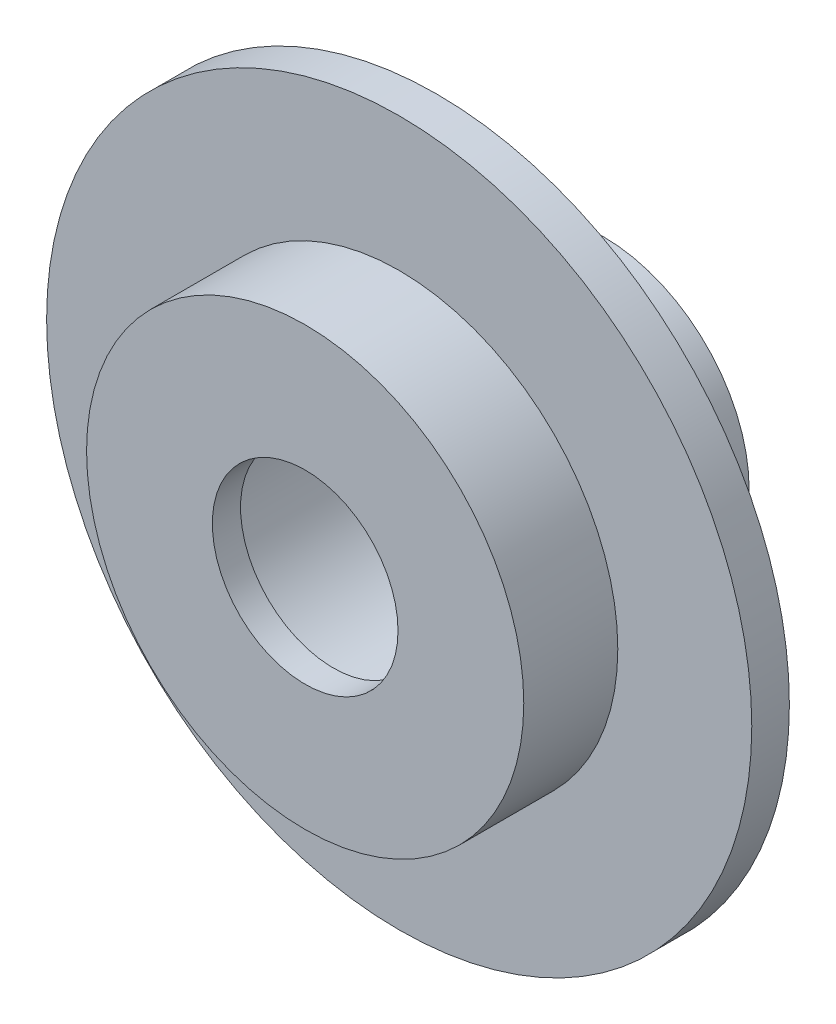
ISO-10303-21;
HEADER;
FILE_DESCRIPTION(('STEP AP214'),'2;1');
FILE_NAME('part.step','',(''),(''),'','','');
FILE_SCHEMA(('AUTOMOTIVE_DESIGN { 1 0 10303 214 1 1 1 1 }'));
ENDSEC;
DATA;
#1=APPLICATION_CONTEXT('core data for automotive mechanical design processes');
#2=APPLICATION_PROTOCOL_DEFINITION('international standard','automotive_design',2000,#1);
#3=PRODUCT_CONTEXT('',#1,'mechanical');
#4=PRODUCT('Part','Part','',(#3));
#5=PRODUCT_RELATED_PRODUCT_CATEGORY('part','',(#4));
#6=PRODUCT_DEFINITION_FORMATION('','',#4);
#7=PRODUCT_DEFINITION_CONTEXT('part definition',#1,'design');
#8=PRODUCT_DEFINITION('design','',#6,#7);
#9=PRODUCT_DEFINITION_SHAPE('','',#8);
#10=(LENGTH_UNIT() NAMED_UNIT(*) SI_UNIT(.MILLI.,.METRE.));
#11=(NAMED_UNIT(*) PLANE_ANGLE_UNIT() SI_UNIT($,.RADIAN.));
#12=(NAMED_UNIT(*) SI_UNIT($,.STERADIAN.) SOLID_ANGLE_UNIT());
#13=UNCERTAINTY_MEASURE_WITH_UNIT(LENGTH_MEASURE(1.E-05),#10,'distance_accuracy_value','');
#14=(GEOMETRIC_REPRESENTATION_CONTEXT(3) GLOBAL_UNCERTAINTY_ASSIGNED_CONTEXT((#13)) GLOBAL_UNIT_ASSIGNED_CONTEXT((#10,
#11,#12)) REPRESENTATION_CONTEXT('',''));
#15=CARTESIAN_POINT('',(0.,0.,0.));
#16=DIRECTION('',(0.,0.,1.));
#17=DIRECTION('',(1.,0.,0.));
#18=AXIS2_PLACEMENT_3D('',#15,#16,#17);
#19=CARTESIAN_POINT('',(0.,0.,2.032));
#20=DIRECTION('',(0.,0.,-1.));
#21=DIRECTION('',(-1.,0.,0.));
#22=AXIS2_PLACEMENT_3D('',#19,#20,#21);
#23=CYLINDRICAL_SURFACE('',#22,19.05);
#24=CARTESIAN_POINT('',(0.,0.,2.032));
#25=DIRECTION('',(0.,0.,1.));
#26=DIRECTION('',(1.,0.,0.));
#27=AXIS2_PLACEMENT_3D('',#24,#25,#26);
#28=CIRCLE('',#27,19.05);
#29=CARTESIAN_POINT('',(19.05,0.,2.032));
#30=VERTEX_POINT('',#29);
#31=EDGE_CURVE('E49',#30,#30,#28,.T.);
#32=ORIENTED_EDGE('',*,*,#31,.F.);
#33=EDGE_LOOP('',(#32));
#34=FACE_BOUND('',#33,.T.);
#35=CARTESIAN_POINT('',(0.,0.,0.));
#36=DIRECTION('',(0.,0.,1.));
#37=DIRECTION('',(1.,0.,0.));
#38=AXIS2_PLACEMENT_3D('',#35,#36,#37);
#39=CIRCLE('',#38,19.05);
#40=CARTESIAN_POINT('',(19.05,0.,0.));
#41=VERTEX_POINT('',#40);
#42=EDGE_CURVE('E53',#41,#41,#39,.T.);
#43=ORIENTED_EDGE('',*,*,#42,.T.);
#44=EDGE_LOOP('',(#43));
#45=FACE_BOUND('',#44,.T.);
#46=ADVANCED_FACE('F43',(#34,#45),#23,.T.);
#47=CARTESIAN_POINT('',(0.,0.,2.032));
#48=DIRECTION('',(0.,0.,1.));
#49=DIRECTION('',(1.,0.,0.));
#50=AXIS2_PLACEMENT_3D('',#47,#48,#49);
#51=PLANE('',#50);
#52=CARTESIAN_POINT('',(0.,0.,2.032));
#53=DIRECTION('',(0.,0.,1.));
#54=DIRECTION('',(1.,0.,0.));
#55=AXIS2_PLACEMENT_3D('',#52,#53,#54);
#56=CIRCLE('',#55,11.811);
#57=CARTESIAN_POINT('',(11.811,0.,2.032));
#58=VERTEX_POINT('',#57);
#59=EDGE_CURVE('E60',#58,#58,#56,.T.);
#60=ORIENTED_EDGE('',*,*,#59,.F.);
#61=EDGE_LOOP('',(#60));
#62=FACE_BOUND('',#61,.T.);
#63=ORIENTED_EDGE('',*,*,#31,.T.);
#64=EDGE_LOOP('',(#63));
#65=FACE_BOUND('',#64,.T.);
#66=ADVANCED_FACE('F102',(#62,#65),#51,.T.);
#67=CARTESIAN_POINT('',(0.,0.,0.));
#68=DIRECTION('',(0.,0.,1.));
#69=DIRECTION('',(1.,0.,0.));
#70=AXIS2_PLACEMENT_3D('',#67,#68,#69);
#71=PLANE('',#70);
#72=CARTESIAN_POINT('',(0.,0.,0.));
#73=DIRECTION('',(0.,0.,1.));
#74=DIRECTION('',(1.,0.,0.));
#75=AXIS2_PLACEMENT_3D('',#72,#73,#74);
#76=CIRCLE('',#75,7.875);
#77=CARTESIAN_POINT('',(7.875,0.,0.));
#78=VERTEX_POINT('',#77);
#79=EDGE_CURVE('E12',#78,#78,#76,.F.);
#80=ORIENTED_EDGE('',*,*,#79,.F.);
#81=EDGE_LOOP('',(#80));
#82=FACE_BOUND('',#81,.T.);
#83=ORIENTED_EDGE('',*,*,#42,.F.);
#84=EDGE_LOOP('',(#83));
#85=FACE_BOUND('',#84,.T.);
#86=ADVANCED_FACE('F107',(#82,#85),#71,.F.);
#87=CARTESIAN_POINT('',(0.,0.,7.112));
#88=DIRECTION('',(0.,0.,-1.));
#89=DIRECTION('',(-1.,0.,0.));
#90=AXIS2_PLACEMENT_3D('',#87,#88,#89);
#91=CYLINDRICAL_SURFACE('',#90,11.811);
#92=CARTESIAN_POINT('',(0.,0.,7.112));
#93=DIRECTION('',(0.,0.,1.));
#94=DIRECTION('',(1.,0.,0.));
#95=AXIS2_PLACEMENT_3D('',#92,#93,#94);
#96=CIRCLE('',#95,11.811);
#97=CARTESIAN_POINT('',(11.811,0.,7.112));
#98=VERTEX_POINT('',#97);
#99=EDGE_CURVE('E58',#98,#98,#96,.T.);
#100=ORIENTED_EDGE('',*,*,#99,.F.);
#101=EDGE_LOOP('',(#100));
#102=FACE_BOUND('',#101,.T.);
#103=ORIENTED_EDGE('',*,*,#59,.T.);
#104=EDGE_LOOP('',(#103));
#105=FACE_BOUND('',#104,.T.);
#106=ADVANCED_FACE('F114',(#102,#105),#91,.T.);
#107=CARTESIAN_POINT('',(0.,0.,7.112));
#108=DIRECTION('',(0.,0.,1.));
#109=DIRECTION('',(1.,0.,0.));
#110=AXIS2_PLACEMENT_3D('',#107,#108,#109);
#111=PLANE('',#110);
#112=CARTESIAN_POINT('',(0.,0.,7.112));
#113=DIRECTION('',(0.,0.,1.));
#114=DIRECTION('',(1.,0.,0.));
#115=AXIS2_PLACEMENT_3D('',#112,#113,#114);
#116=CIRCLE('',#115,5.0165);
#117=CARTESIAN_POINT('',(5.0165,0.,7.112));
#118=VERTEX_POINT('',#117);
#119=EDGE_CURVE('E63',#118,#118,#116,.T.);
#120=ORIENTED_EDGE('',*,*,#119,.F.);
#121=EDGE_LOOP('',(#120));
#122=FACE_BOUND('',#121,.T.);
#123=ORIENTED_EDGE('',*,*,#99,.T.);
#124=EDGE_LOOP('',(#123));
#125=FACE_BOUND('',#124,.T.);
#126=ADVANCED_FACE('F98',(#122,#125),#111,.T.);
#127=CARTESIAN_POINT('',(0.,0.,5.588));
#128=DIRECTION('',(0.,0.,1.));
#129=DIRECTION('',(1.,0.,0.));
#130=AXIS2_PLACEMENT_3D('',#127,#128,#129);
#131=CYLINDRICAL_SURFACE('',#130,5.0165);
#132=CARTESIAN_POINT('',(0.,0.,5.588));
#133=DIRECTION('',(0.,0.,1.));
#134=DIRECTION('',(1.,0.,0.));
#135=AXIS2_PLACEMENT_3D('',#132,#133,#134);
#136=CIRCLE('',#135,5.0165);
#137=CARTESIAN_POINT('',(5.0165,0.,5.588));
#138=VERTEX_POINT('',#137);
#139=EDGE_CURVE('E71',#138,#138,#136,.F.);
#140=CARTESIAN_POINT('',(5.0165,0.,5.588));
#141=CARTESIAN_POINT('',(5.0165,0.,5.603875));
#142=CARTESIAN_POINT('',(5.0165,0.,5.61975));
#143=CARTESIAN_POINT('',(5.0165,0.,5.6515));
#144=CARTESIAN_POINT('',(5.0165,0.,5.667375));
#145=CARTESIAN_POINT('',(5.0165,0.,5.699125));
#146=CARTESIAN_POINT('',(5.0165,0.,5.715));
#147=CARTESIAN_POINT('',(5.0165,0.,5.74675));
#148=CARTESIAN_POINT('',(5.0165,0.,5.762625));
#149=CARTESIAN_POINT('',(5.0165,0.,5.794375));
#150=CARTESIAN_POINT('',(5.0165,0.,5.81025));
#151=CARTESIAN_POINT('',(5.0165,0.,5.842));
#152=CARTESIAN_POINT('',(5.0165,0.,5.857875));
#153=CARTESIAN_POINT('',(5.0165,0.,5.889625));
#154=CARTESIAN_POINT('',(5.0165,0.,5.9055));
#155=CARTESIAN_POINT('',(5.0165,0.,5.93725));
#156=CARTESIAN_POINT('',(5.0165,0.,5.953125));
#157=CARTESIAN_POINT('',(5.0165,0.,5.984875));
#158=CARTESIAN_POINT('',(5.0165,0.,6.00075));
#159=CARTESIAN_POINT('',(5.0165,0.,6.0325));
#160=CARTESIAN_POINT('',(5.0165,0.,6.048375));
#161=CARTESIAN_POINT('',(5.0165,0.,6.080125));
#162=CARTESIAN_POINT('',(5.0165,0.,6.096));
#163=CARTESIAN_POINT('',(5.0165,0.,6.12775));
#164=CARTESIAN_POINT('',(5.0165,0.,6.143625));
#165=CARTESIAN_POINT('',(5.0165,0.,6.175375));
#166=CARTESIAN_POINT('',(5.0165,0.,6.19125));
#167=CARTESIAN_POINT('',(5.0165,0.,6.223));
#168=CARTESIAN_POINT('',(5.0165,0.,6.238875));
#169=CARTESIAN_POINT('',(5.0165,0.,6.270625));
#170=CARTESIAN_POINT('',(5.0165,0.,6.2865));
#171=CARTESIAN_POINT('',(5.0165,0.,6.31825));
#172=CARTESIAN_POINT('',(5.0165,0.,6.334125));
#173=CARTESIAN_POINT('',(5.0165,0.,6.365875));
#174=CARTESIAN_POINT('',(5.0165,0.,6.38175));
#175=CARTESIAN_POINT('',(5.0165,0.,6.4135));
#176=CARTESIAN_POINT('',(5.0165,0.,6.429375));
#177=CARTESIAN_POINT('',(5.0165,0.,6.461125));
#178=CARTESIAN_POINT('',(5.0165,0.,6.477));
#179=CARTESIAN_POINT('',(5.0165,0.,6.50875));
#180=CARTESIAN_POINT('',(5.0165,0.,6.524625));
#181=CARTESIAN_POINT('',(5.0165,0.,6.556375));
#182=CARTESIAN_POINT('',(5.0165,0.,6.57225));
#183=CARTESIAN_POINT('',(5.0165,0.,6.604));
#184=CARTESIAN_POINT('',(5.0165,0.,6.619875));
#185=CARTESIAN_POINT('',(5.0165,0.,6.651625));
#186=CARTESIAN_POINT('',(5.0165,0.,6.6675));
#187=CARTESIAN_POINT('',(5.0165,0.,6.69925));
#188=CARTESIAN_POINT('',(5.0165,0.,6.715125));
#189=CARTESIAN_POINT('',(5.0165,0.,6.746875));
#190=CARTESIAN_POINT('',(5.0165,0.,6.76275));
#191=CARTESIAN_POINT('',(5.0165,0.,6.7945));
#192=CARTESIAN_POINT('',(5.0165,0.,6.810375));
#193=CARTESIAN_POINT('',(5.0165,0.,6.842125));
#194=CARTESIAN_POINT('',(5.0165,0.,6.858));
#195=CARTESIAN_POINT('',(5.0165,0.,6.88975));
#196=CARTESIAN_POINT('',(5.0165,0.,6.905625));
#197=CARTESIAN_POINT('',(5.0165,0.,6.937375));
#198=CARTESIAN_POINT('',(5.0165,0.,6.95325));
#199=CARTESIAN_POINT('',(5.0165,0.,6.985));
#200=CARTESIAN_POINT('',(5.0165,0.,7.000875));
#201=CARTESIAN_POINT('',(5.0165,0.,7.032625));
#202=CARTESIAN_POINT('',(5.0165,0.,7.0485));
#203=CARTESIAN_POINT('',(5.0165,0.,7.08025));
#204=CARTESIAN_POINT('',(5.0165,0.,7.096125));
#205=CARTESIAN_POINT('',(5.0165,0.,7.112));
#206=B_SPLINE_CURVE_WITH_KNOTS('',3,(#140,#141,#142,#143,#144,#145,#146,#147,#148,#149,#150,
#151,#152,#153,#154,#155,#156,#157,#158,#159,#160,#161,#162,#163,#164,#165,#166,#167,#168,#169,
#170,#171,#172,#173,#174,#175,#176,#177,#178,#179,#180,#181,#182,#183,#184,#185,#186,#187,#188,
#189,#190,#191,#192,#193,#194,#195,#196,#197,#198,#199,#200,#201,#202,#203,#204,#205),
.UNSPECIFIED.,.F.,.F.,(4,2,2,2,2,2,2,2,2,2,2,2,2,2,2,2,2,2,2,2,2,2,2,2,2,2,2,2,2,2,2,2,4),(0.,
0.0476250000000008,0.0952500000000007,0.142875000000001,0.190500000000001,0.238125,0.28575,
0.333375,0.381,0.428625,0.47625,0.523875,0.571500000000001,0.619125000000001,0.666750000000001,
0.714375000000001,0.762000000000001,0.809625,0.85725,0.904875,0.9525,1.000125,1.04775,1.095375,
1.143,1.190625,1.23825,1.285875,1.3335,1.381125,1.42875,1.476375,1.524),.UNSPECIFIED.);
#207=EDGE_CURVE('BSEAM93',#138,#118,#206,.T.);
#208=ORIENTED_EDGE('',*,*,#139,.T.);
#209=ORIENTED_EDGE('',*,*,#119,.T.);
#210=ORIENTED_EDGE('',*,*,#207,.T.);
#211=ORIENTED_EDGE('',*,*,#207,.F.);
#212=EDGE_LOOP('',(#208,#210,#209,#211));
#213=FACE_BOUND('',#212,.T.);
#214=ADVANCED_FACE('F93',(#213),#131,.F.);
#215=CARTESIAN_POINT('',(0.,0.,-9.));
#216=DIRECTION('',(0.,0.,1.));
#217=DIRECTION('',(1.,0.,0.));
#218=AXIS2_PLACEMENT_3D('',#215,#216,#217);
#219=CYLINDRICAL_SURFACE('',#218,7.875);
#220=CARTESIAN_POINT('',(0.,0.,-9.));
#221=DIRECTION('',(0.,0.,-1.));
#222=DIRECTION('',(-1.,0.,0.));
#223=AXIS2_PLACEMENT_3D('',#220,#221,#222);
#224=CIRCLE('',#223,7.875);
#225=CARTESIAN_POINT('',(-7.875,0.,-9.));
#226=VERTEX_POINT('',#225);
#227=EDGE_CURVE('E68',#226,#226,#224,.T.);
#228=ORIENTED_EDGE('',*,*,#227,.F.);
#229=EDGE_LOOP('',(#228));
#230=FACE_BOUND('',#229,.T.);
#231=ORIENTED_EDGE('',*,*,#79,.T.);
#232=EDGE_LOOP('',(#231));
#233=FACE_BOUND('',#232,.T.);
#234=ADVANCED_FACE('F88',(#230,#233),#219,.T.);
#235=CARTESIAN_POINT('',(0.,0.,-9.));
#236=DIRECTION('',(0.,0.,-1.));
#237=DIRECTION('',(-1.,0.,0.));
#238=AXIS2_PLACEMENT_3D('',#235,#236,#237);
#239=PLANE('',#238);
#240=CARTESIAN_POINT('',(0.,0.,-9.));
#241=DIRECTION('',(0.,0.,-1.));
#242=DIRECTION('',(-1.,0.,0.));
#243=AXIS2_PLACEMENT_3D('',#240,#241,#242);
#244=CIRCLE('',#243,6.875);
#245=CARTESIAN_POINT('',(-6.875,0.,-9.));
#246=VERTEX_POINT('',#245);
#247=EDGE_CURVE('E77',#246,#246,#244,.T.);
#248=ORIENTED_EDGE('',*,*,#247,.F.);
#249=EDGE_LOOP('',(#248));
#250=FACE_BOUND('',#249,.T.);
#251=ORIENTED_EDGE('',*,*,#227,.T.);
#252=EDGE_LOOP('',(#251));
#253=FACE_BOUND('',#252,.T.);
#254=ADVANCED_FACE('F84',(#250,#253),#239,.T.);
#255=CARTESIAN_POINT('',(0.,0.,5.588));
#256=DIRECTION('',(0.,0.,1.));
#257=DIRECTION('',(1.,0.,0.));
#258=AXIS2_PLACEMENT_3D('',#255,#256,#257);
#259=PLANE('',#258);
#260=CARTESIAN_POINT('',(0.,0.,5.588));
#261=DIRECTION('',(0.,0.,1.));
#262=DIRECTION('',(1.,0.,0.));
#263=AXIS2_PLACEMENT_3D('',#260,#261,#262);
#264=CIRCLE('',#263,6.875);
#265=CARTESIAN_POINT('',(6.875,0.,5.588));
#266=VERTEX_POINT('',#265);
#267=EDGE_CURVE('E74',#266,#266,#264,.F.);
#268=ORIENTED_EDGE('',*,*,#267,.T.);
#269=EDGE_LOOP('',(#268));
#270=FACE_BOUND('',#269,.T.);
#271=ORIENTED_EDGE('',*,*,#139,.F.);
#272=EDGE_LOOP('',(#271));
#273=FACE_BOUND('',#272,.T.);
#274=ADVANCED_FACE('F87',(#270,#273),#259,.F.);
#275=CARTESIAN_POINT('',(0.,0.,25.0334364826301));
#276=DIRECTION('',(0.,0.,-1.));
#277=DIRECTION('',(-1.,0.,0.));
#278=AXIS2_PLACEMENT_3D('',#275,#276,#277);
#279=CYLINDRICAL_SURFACE('',#278,6.875);
#280=ORIENTED_EDGE('',*,*,#247,.T.);
#281=EDGE_LOOP('',(#280));
#282=FACE_BOUND('',#281,.T.);
#283=ORIENTED_EDGE('',*,*,#267,.F.);
#284=EDGE_LOOP('',(#283));
#285=FACE_BOUND('',#284,.T.);
#286=ADVANCED_FACE('F81',(#282,#285),#279,.F.);
#287=CLOSED_SHELL('',(#46,#66,#86,#106,#126,#214,#234,#254,#274,#286));
#288=MANIFOLD_SOLID_BREP('B2',#287);
#289=ADVANCED_BREP_SHAPE_REPRESENTATION('',(#18,#288),#14);
#290=SHAPE_DEFINITION_REPRESENTATION(#9,#289);
ENDSEC;
END-ISO-10303-21;
